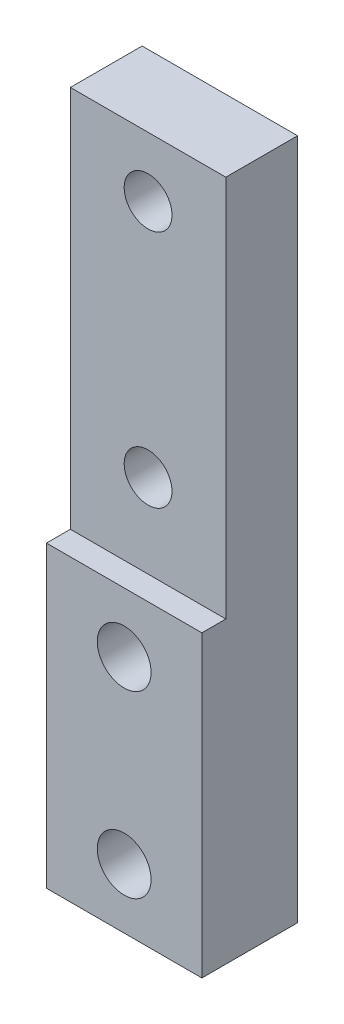
ISO-10303-21;
HEADER;
FILE_DESCRIPTION(('STEP AP214'),'2;1');
FILE_NAME('part.step','',(''),(''),'','','');
FILE_SCHEMA(('AUTOMOTIVE_DESIGN { 1 0 10303 214 1 1 1 1 }'));
ENDSEC;
DATA;
#1=APPLICATION_CONTEXT('core data for automotive mechanical design processes');
#2=APPLICATION_PROTOCOL_DEFINITION('international standard','automotive_design',2000,#1);
#3=PRODUCT_CONTEXT('',#1,'mechanical');
#4=PRODUCT('Part','Part','',(#3));
#5=PRODUCT_RELATED_PRODUCT_CATEGORY('part','',(#4));
#6=PRODUCT_DEFINITION_FORMATION('','',#4);
#7=PRODUCT_DEFINITION_CONTEXT('part definition',#1,'design');
#8=PRODUCT_DEFINITION('design','',#6,#7);
#9=PRODUCT_DEFINITION_SHAPE('','',#8);
#10=(LENGTH_UNIT() NAMED_UNIT(*) SI_UNIT(.MILLI.,.METRE.));
#11=(NAMED_UNIT(*) PLANE_ANGLE_UNIT() SI_UNIT($,.RADIAN.));
#12=(NAMED_UNIT(*) SI_UNIT($,.STERADIAN.) SOLID_ANGLE_UNIT());
#13=UNCERTAINTY_MEASURE_WITH_UNIT(LENGTH_MEASURE(1.E-05),#10,'distance_accuracy_value','');
#14=(GEOMETRIC_REPRESENTATION_CONTEXT(3) GLOBAL_UNCERTAINTY_ASSIGNED_CONTEXT((#13)) GLOBAL_UNIT_ASSIGNED_CONTEXT((#10,
#11,#12)) REPRESENTATION_CONTEXT('',''));
#15=CARTESIAN_POINT('',(0.,0.,0.));
#16=DIRECTION('',(0.,0.,1.));
#17=DIRECTION('',(1.,0.,0.));
#18=AXIS2_PLACEMENT_3D('',#15,#16,#17);
#19=CARTESIAN_POINT('',(0.,0.,8.));
#20=DIRECTION('',(0.,0.,-1.));
#21=DIRECTION('',(-1.,0.,0.));
#22=AXIS2_PLACEMENT_3D('',#19,#20,#21);
#23=PLANE('',#22);
#24=CARTESIAN_POINT('',(0.,-7.5,8.));
#25=DIRECTION('',(0.,0.,-1.));
#26=DIRECTION('',(-1.,0.,0.));
#27=AXIS2_PLACEMENT_3D('',#24,#25,#26);
#28=CIRCLE('',#27,2.25);
#29=CARTESIAN_POINT('',(-2.25,-7.5,8.));
#30=VERTEX_POINT('',#29);
#31=EDGE_CURVE('E212',#30,#30,#28,.T.);
#32=ORIENTED_EDGE('',*,*,#31,.T.);
#33=EDGE_LOOP('',(#32));
#34=FACE_BOUND('',#33,.T.);
#35=CARTESIAN_POINT('',(0.,7.5,8.));
#36=DIRECTION('',(0.,0.,-1.));
#37=DIRECTION('',(-1.,0.,0.));
#38=AXIS2_PLACEMENT_3D('',#35,#36,#37);
#39=CIRCLE('',#38,2.25);
#40=CARTESIAN_POINT('',(-2.25,7.5,8.));
#41=VERTEX_POINT('',#40);
#42=EDGE_CURVE('E222',#41,#41,#39,.T.);
#43=ORIENTED_EDGE('',*,*,#42,.T.);
#44=EDGE_LOOP('',(#43));
#45=FACE_BOUND('',#44,.T.);
#46=DIRECTION('',(0.,1.,0.));
#47=VECTOR('',#46,1.);
#48=CARTESIAN_POINT('',(6.5,-12.5,8.));
#49=LINE('',#48,#47);
#50=CARTESIAN_POINT('',(6.5,-12.5,8.));
#51=VERTEX_POINT('',#50);
#52=CARTESIAN_POINT('',(6.5,12.5,8.));
#53=VERTEX_POINT('',#52);
#54=EDGE_CURVE('E124',#51,#53,#49,.T.);
#55=ORIENTED_EDGE('',*,*,#54,.T.);
#56=DIRECTION('',(-1.,0.,0.));
#57=VECTOR('',#56,1.);
#58=CARTESIAN_POINT('',(-6.5,12.5,8.));
#59=LINE('',#58,#57);
#60=CARTESIAN_POINT('',(-6.5,12.5,8.));
#61=VERTEX_POINT('',#60);
#62=EDGE_CURVE('E79',#53,#61,#59,.T.);
#63=ORIENTED_EDGE('',*,*,#62,.T.);
#64=DIRECTION('',(0.,-1.,0.));
#65=VECTOR('',#64,1.);
#66=CARTESIAN_POINT('',(-6.5,-12.5,8.));
#67=LINE('',#66,#65);
#68=CARTESIAN_POINT('',(-6.5,-12.5,8.));
#69=VERTEX_POINT('',#68);
#70=EDGE_CURVE('E127',#61,#69,#67,.T.);
#71=ORIENTED_EDGE('',*,*,#70,.T.);
#72=DIRECTION('',(1.,0.,0.));
#73=VECTOR('',#72,1.);
#74=CARTESIAN_POINT('',(-6.5,-12.5,8.));
#75=LINE('',#74,#73);
#76=EDGE_CURVE('E57',#69,#51,#75,.T.);
#77=ORIENTED_EDGE('',*,*,#76,.T.);
#78=EDGE_LOOP('',(#55,#63,#71,#77));
#79=FACE_BOUND('',#78,.T.);
#80=ADVANCED_FACE('F33',(#34,#45,#79),#23,.F.);
#81=CARTESIAN_POINT('',(0.,0.,0.));
#82=DIRECTION('',(0.,0.,-1.));
#83=DIRECTION('',(-1.,0.,0.));
#84=AXIS2_PLACEMENT_3D('',#81,#82,#83);
#85=PLANE('',#84);
#86=CARTESIAN_POINT('',(0.,-7.5,0.));
#87=DIRECTION('',(0.,0.,-1.));
#88=DIRECTION('',(-1.,0.,0.));
#89=AXIS2_PLACEMENT_3D('',#86,#87,#88);
#90=CIRCLE('',#89,4.7);
#91=CARTESIAN_POINT('',(-4.7,-7.5,0.));
#92=VERTEX_POINT('',#91);
#93=EDGE_CURVE('E210',#92,#92,#90,.T.);
#94=ORIENTED_EDGE('',*,*,#93,.F.);
#95=EDGE_LOOP('',(#94));
#96=FACE_BOUND('',#95,.T.);
#97=CARTESIAN_POINT('',(0.,7.5,0.));
#98=DIRECTION('',(0.,0.,-1.));
#99=DIRECTION('',(-1.,0.,0.));
#100=AXIS2_PLACEMENT_3D('',#97,#98,#99);
#101=CIRCLE('',#100,4.7);
#102=CARTESIAN_POINT('',(-4.7,7.5,0.));
#103=VERTEX_POINT('',#102);
#104=EDGE_CURVE('E216',#103,#103,#101,.T.);
#105=ORIENTED_EDGE('',*,*,#104,.F.);
#106=EDGE_LOOP('',(#105));
#107=FACE_BOUND('',#106,.T.);
#108=DIRECTION('',(0.,1.,0.));
#109=VECTOR('',#108,1.);
#110=CARTESIAN_POINT('',(6.5,-12.5,0.));
#111=LINE('',#110,#109);
#112=CARTESIAN_POINT('',(6.5,-12.5,0.));
#113=VERTEX_POINT('',#112);
#114=CARTESIAN_POINT('',(6.5,44.5,0.));
#115=VERTEX_POINT('',#114);
#116=EDGE_CURVE('E122',#113,#115,#111,.T.);
#117=ORIENTED_EDGE('',*,*,#116,.F.);
#118=DIRECTION('',(1.,0.,0.));
#119=VECTOR('',#118,1.);
#120=CARTESIAN_POINT('',(-6.5,-12.5,0.));
#121=LINE('',#120,#119);
#122=CARTESIAN_POINT('',(-6.5,-12.5,0.));
#123=VERTEX_POINT('',#122);
#124=EDGE_CURVE('E72',#123,#113,#121,.T.);
#125=ORIENTED_EDGE('',*,*,#124,.F.);
#126=DIRECTION('',(0.,-1.,0.));
#127=VECTOR('',#126,1.);
#128=CARTESIAN_POINT('',(-6.5,-12.5,0.));
#129=LINE('',#128,#127);
#130=CARTESIAN_POINT('',(-6.49999999999999,44.5,0.));
#131=VERTEX_POINT('',#130);
#132=EDGE_CURVE('E132',#131,#123,#129,.T.);
#133=ORIENTED_EDGE('',*,*,#132,.F.);
#134=DIRECTION('',(1.,0.,0.));
#135=VECTOR('',#134,1.);
#136=CARTESIAN_POINT('',(-6.49999999999999,44.5,0.));
#137=LINE('',#136,#135);
#138=EDGE_CURVE('E103',#131,#115,#137,.T.);
#139=ORIENTED_EDGE('',*,*,#138,.T.);
#140=EDGE_LOOP('',(#117,#125,#133,#139));
#141=FACE_BOUND('',#140,.T.);
#142=CARTESIAN_POINT('',(0.,19.5,0.));
#143=DIRECTION('',(0.,0.,-1.));
#144=DIRECTION('',(-1.,0.,0.));
#145=AXIS2_PLACEMENT_3D('',#142,#143,#144);
#146=CIRCLE('',#145,2.);
#147=CARTESIAN_POINT('',(-2.,19.5,0.));
#148=VERTEX_POINT('',#147);
#149=EDGE_CURVE('E225',#148,#148,#146,.T.);
#150=ORIENTED_EDGE('',*,*,#149,.F.);
#151=EDGE_LOOP('',(#150));
#152=FACE_BOUND('',#151,.T.);
#153=CARTESIAN_POINT('',(0.,39.5,0.));
#154=DIRECTION('',(0.,0.,-1.));
#155=DIRECTION('',(-1.,0.,0.));
#156=AXIS2_PLACEMENT_3D('',#153,#154,#155);
#157=CIRCLE('',#156,2.);
#158=CARTESIAN_POINT('',(-2.,39.5,0.));
#159=VERTEX_POINT('',#158);
#160=EDGE_CURVE('E228',#159,#159,#157,.T.);
#161=ORIENTED_EDGE('',*,*,#160,.F.);
#162=EDGE_LOOP('',(#161));
#163=FACE_BOUND('',#162,.T.);
#164=ADVANCED_FACE('F141',(#96,#107,#141,#152,#163),#85,.T.);
#165=CARTESIAN_POINT('',(6.5,-12.5,8.));
#166=DIRECTION('',(-1.,0.,0.));
#167=DIRECTION('',(0.,0.,1.));
#168=AXIS2_PLACEMENT_3D('',#165,#166,#167);
#169=PLANE('',#168);
#170=ORIENTED_EDGE('',*,*,#116,.T.);
#171=DIRECTION('',(0.,0.,-1.));
#172=VECTOR('',#171,1.);
#173=CARTESIAN_POINT('',(6.5,44.5,6.));
#174=LINE('',#173,#172);
#175=CARTESIAN_POINT('',(6.5,44.5,6.));
#176=VERTEX_POINT('',#175);
#177=EDGE_CURVE('E105',#176,#115,#174,.T.);
#178=ORIENTED_EDGE('',*,*,#177,.F.);
#179=DIRECTION('',(0.,-1.,0.));
#180=VECTOR('',#179,1.);
#181=CARTESIAN_POINT('',(6.5,12.5,6.));
#182=LINE('',#181,#180);
#183=CARTESIAN_POINT('',(6.5,12.5,6.));
#184=VERTEX_POINT('',#183);
#185=EDGE_CURVE('E106',#176,#184,#182,.T.);
#186=ORIENTED_EDGE('',*,*,#185,.T.);
#187=DIRECTION('',(0.,0.,-1.));
#188=VECTOR('',#187,1.);
#189=CARTESIAN_POINT('',(6.5,12.5,8.));
#190=LINE('',#189,#188);
#191=EDGE_CURVE('E11',#53,#184,#190,.T.);
#192=ORIENTED_EDGE('',*,*,#191,.F.);
#193=ORIENTED_EDGE('',*,*,#54,.F.);
#194=DIRECTION('',(0.,0.,-1.));
#195=VECTOR('',#194,1.);
#196=CARTESIAN_POINT('',(6.5,-12.5,8.));
#197=LINE('',#196,#195);
#198=EDGE_CURVE('E130',#51,#113,#197,.T.);
#199=ORIENTED_EDGE('',*,*,#198,.T.);
#200=EDGE_LOOP('',(#170,#178,#186,#192,#193,#199));
#201=FACE_BOUND('',#200,.T.);
#202=ADVANCED_FACE('F35',(#201),#169,.F.);
#203=CARTESIAN_POINT('',(-6.5,12.5,8.));
#204=DIRECTION('',(0.,-1.,0.));
#205=DIRECTION('',(1.,0.,0.));
#206=AXIS2_PLACEMENT_3D('',#203,#204,#205);
#207=PLANE('',#206);
#208=ORIENTED_EDGE('',*,*,#191,.T.);
#209=DIRECTION('',(-1.,0.,0.));
#210=VECTOR('',#209,1.);
#211=CARTESIAN_POINT('',(6.5,12.5,6.));
#212=LINE('',#211,#210);
#213=CARTESIAN_POINT('',(-6.5,12.5,6.));
#214=VERTEX_POINT('',#213);
#215=EDGE_CURVE('E114',#184,#214,#212,.T.);
#216=ORIENTED_EDGE('',*,*,#215,.T.);
#217=DIRECTION('',(0.,0.,-1.));
#218=VECTOR('',#217,1.);
#219=CARTESIAN_POINT('',(-6.5,12.5,8.));
#220=LINE('',#219,#218);
#221=EDGE_CURVE('E41',#61,#214,#220,.T.);
#222=ORIENTED_EDGE('',*,*,#221,.F.);
#223=ORIENTED_EDGE('',*,*,#62,.F.);
#224=EDGE_LOOP('',(#208,#216,#222,#223));
#225=FACE_BOUND('',#224,.T.);
#226=ADVANCED_FACE('F146',(#225),#207,.F.);
#227=CARTESIAN_POINT('',(-6.5,-12.5,8.));
#228=DIRECTION('',(1.,0.,0.));
#229=DIRECTION('',(0.,1.,0.));
#230=AXIS2_PLACEMENT_3D('',#227,#228,#229);
#231=PLANE('',#230);
#232=ORIENTED_EDGE('',*,*,#132,.T.);
#233=DIRECTION('',(0.,0.,-1.));
#234=VECTOR('',#233,1.);
#235=CARTESIAN_POINT('',(-6.5,-12.5,8.));
#236=LINE('',#235,#234);
#237=EDGE_CURVE('E136',#69,#123,#236,.T.);
#238=ORIENTED_EDGE('',*,*,#237,.F.);
#239=ORIENTED_EDGE('',*,*,#70,.F.);
#240=ORIENTED_EDGE('',*,*,#221,.T.);
#241=DIRECTION('',(0.,1.,0.));
#242=VECTOR('',#241,1.);
#243=CARTESIAN_POINT('',(-6.5,12.5,6.));
#244=LINE('',#243,#242);
#245=CARTESIAN_POINT('',(-6.49999999999999,44.5,6.));
#246=VERTEX_POINT('',#245);
#247=EDGE_CURVE('E48',#214,#246,#244,.T.);
#248=ORIENTED_EDGE('',*,*,#247,.T.);
#249=DIRECTION('',(0.,0.,-1.));
#250=VECTOR('',#249,1.);
#251=CARTESIAN_POINT('',(-6.49999999999999,44.5,6.));
#252=LINE('',#251,#250);
#253=EDGE_CURVE('E97',#246,#131,#252,.T.);
#254=ORIENTED_EDGE('',*,*,#253,.T.);
#255=EDGE_LOOP('',(#232,#238,#239,#240,#248,#254));
#256=FACE_BOUND('',#255,.T.);
#257=ADVANCED_FACE('F112',(#256),#231,.F.);
#258=CARTESIAN_POINT('',(-6.5,-12.5,8.));
#259=DIRECTION('',(0.,1.,0.));
#260=DIRECTION('',(-1.,0.,0.));
#261=AXIS2_PLACEMENT_3D('',#258,#259,#260);
#262=PLANE('',#261);
#263=ORIENTED_EDGE('',*,*,#124,.T.);
#264=ORIENTED_EDGE('',*,*,#198,.F.);
#265=ORIENTED_EDGE('',*,*,#76,.F.);
#266=ORIENTED_EDGE('',*,*,#237,.T.);
#267=EDGE_LOOP('',(#263,#264,#265,#266));
#268=FACE_BOUND('',#267,.T.);
#269=ADVANCED_FACE('F138',(#268),#262,.F.);
#270=CARTESIAN_POINT('',(-6.49999999999999,44.5,6.));
#271=DIRECTION('',(0.,1.,0.));
#272=DIRECTION('',(0.,0.,1.));
#273=AXIS2_PLACEMENT_3D('',#270,#271,#272);
#274=PLANE('',#273);
#275=ORIENTED_EDGE('',*,*,#138,.F.);
#276=ORIENTED_EDGE('',*,*,#253,.F.);
#277=DIRECTION('',(1.,0.,0.));
#278=VECTOR('',#277,1.);
#279=CARTESIAN_POINT('',(-6.49999999999999,44.5,6.));
#280=LINE('',#279,#278);
#281=EDGE_CURVE('E100',#246,#176,#280,.T.);
#282=ORIENTED_EDGE('',*,*,#281,.T.);
#283=ORIENTED_EDGE('',*,*,#177,.T.);
#284=EDGE_LOOP('',(#275,#276,#282,#283));
#285=FACE_BOUND('',#284,.T.);
#286=ADVANCED_FACE('F98',(#285),#274,.T.);
#287=CARTESIAN_POINT('',(0.,0.,6.));
#288=DIRECTION('',(0.,0.,-1.));
#289=DIRECTION('',(-1.,0.,0.));
#290=AXIS2_PLACEMENT_3D('',#287,#288,#289);
#291=PLANE('',#290);
#292=CARTESIAN_POINT('',(0.,19.5,6.));
#293=DIRECTION('',(0.,0.,-1.));
#294=DIRECTION('',(-1.,0.,0.));
#295=AXIS2_PLACEMENT_3D('',#292,#293,#294);
#296=CIRCLE('',#295,2.);
#297=CARTESIAN_POINT('',(-2.,19.5,6.));
#298=VERTEX_POINT('',#297);
#299=EDGE_CURVE('E226',#298,#298,#296,.T.);
#300=ORIENTED_EDGE('',*,*,#299,.T.);
#301=EDGE_LOOP('',(#300));
#302=FACE_BOUND('',#301,.T.);
#303=CARTESIAN_POINT('',(0.,39.5,6.));
#304=DIRECTION('',(0.,0.,-1.));
#305=DIRECTION('',(-1.,0.,0.));
#306=AXIS2_PLACEMENT_3D('',#303,#304,#305);
#307=CIRCLE('',#306,2.);
#308=CARTESIAN_POINT('',(-2.,39.5,6.));
#309=VERTEX_POINT('',#308);
#310=EDGE_CURVE('E121',#309,#309,#307,.T.);
#311=ORIENTED_EDGE('',*,*,#310,.T.);
#312=EDGE_LOOP('',(#311));
#313=FACE_BOUND('',#312,.T.);
#314=ORIENTED_EDGE('',*,*,#215,.F.);
#315=ORIENTED_EDGE('',*,*,#185,.F.);
#316=ORIENTED_EDGE('',*,*,#281,.F.);
#317=ORIENTED_EDGE('',*,*,#247,.F.);
#318=EDGE_LOOP('',(#314,#315,#316,#317));
#319=FACE_BOUND('',#318,.T.);
#320=ADVANCED_FACE('F108',(#302,#313,#319),#291,.F.);
#321=CARTESIAN_POINT('',(0.,39.5,6.));
#322=DIRECTION('',(0.,0.,-1.));
#323=DIRECTION('',(-1.,0.,0.));
#324=AXIS2_PLACEMENT_3D('',#321,#322,#323);
#325=CYLINDRICAL_SURFACE('',#324,2.);
#326=ORIENTED_EDGE('',*,*,#310,.F.);
#327=EDGE_LOOP('',(#326));
#328=FACE_BOUND('',#327,.T.);
#329=ORIENTED_EDGE('',*,*,#160,.T.);
#330=EDGE_LOOP('',(#329));
#331=FACE_BOUND('',#330,.T.);
#332=ADVANCED_FACE('F173',(#328,#331),#325,.F.);
#333=CARTESIAN_POINT('',(0.,19.5,6.));
#334=DIRECTION('',(0.,0.,-1.));
#335=DIRECTION('',(-1.,0.,0.));
#336=AXIS2_PLACEMENT_3D('',#333,#334,#335);
#337=CYLINDRICAL_SURFACE('',#336,2.);
#338=ORIENTED_EDGE('',*,*,#299,.F.);
#339=EDGE_LOOP('',(#338));
#340=FACE_BOUND('',#339,.T.);
#341=ORIENTED_EDGE('',*,*,#149,.T.);
#342=EDGE_LOOP('',(#341));
#343=FACE_BOUND('',#342,.T.);
#344=ADVANCED_FACE('F178',(#340,#343),#337,.F.);
#345=CARTESIAN_POINT('',(0.,7.5,0.));
#346=DIRECTION('',(0.,0.,-1.));
#347=DIRECTION('',(-1.,0.,0.));
#348=AXIS2_PLACEMENT_3D('',#345,#346,#347);
#349=CYLINDRICAL_SURFACE('',#348,2.25);
#350=ORIENTED_EDGE('',*,*,#42,.F.);
#351=EDGE_LOOP('',(#350));
#352=FACE_BOUND('',#351,.T.);
#353=CARTESIAN_POINT('',(0.,7.5,2.45));
#354=DIRECTION('',(0.,0.,-1.));
#355=DIRECTION('',(-1.,0.,0.));
#356=AXIS2_PLACEMENT_3D('',#353,#354,#355);
#357=CIRCLE('',#356,2.25);
#358=CARTESIAN_POINT('',(-2.25,7.5,2.45));
#359=VERTEX_POINT('',#358);
#360=EDGE_CURVE('E219',#359,#359,#357,.T.);
#361=ORIENTED_EDGE('',*,*,#360,.T.);
#362=EDGE_LOOP('',(#361));
#363=FACE_BOUND('',#362,.T.);
#364=ADVANCED_FACE('F186',(#352,#363),#349,.F.);
#365=CARTESIAN_POINT('',(0.,7.5,0.));
#366=DIRECTION('',(0.,0.,-1.));
#367=DIRECTION('',(-1.,0.,0.));
#368=AXIS2_PLACEMENT_3D('',#365,#366,#367);
#369=CONICAL_SURFACE('',#368,4.7,0.785398163397449);
#370=ORIENTED_EDGE('',*,*,#360,.F.);
#371=EDGE_LOOP('',(#370));
#372=FACE_BOUND('',#371,.T.);
#373=ORIENTED_EDGE('',*,*,#104,.T.);
#374=EDGE_LOOP('',(#373));
#375=FACE_BOUND('',#374,.T.);
#376=ADVANCED_FACE('F190',(#372,#375),#369,.F.);
#377=CARTESIAN_POINT('',(0.,-7.5,0.));
#378=DIRECTION('',(0.,0.,-1.));
#379=DIRECTION('',(-1.,0.,0.));
#380=AXIS2_PLACEMENT_3D('',#377,#378,#379);
#381=CYLINDRICAL_SURFACE('',#380,2.25);
#382=ORIENTED_EDGE('',*,*,#31,.F.);
#383=EDGE_LOOP('',(#382));
#384=FACE_BOUND('',#383,.T.);
#385=CARTESIAN_POINT('',(0.,-7.5,2.45));
#386=DIRECTION('',(0.,0.,-1.));
#387=DIRECTION('',(-1.,0.,0.));
#388=AXIS2_PLACEMENT_3D('',#385,#386,#387);
#389=CIRCLE('',#388,2.25);
#390=CARTESIAN_POINT('',(-2.25,-7.5,2.45));
#391=VERTEX_POINT('',#390);
#392=EDGE_CURVE('E207',#391,#391,#389,.T.);
#393=ORIENTED_EDGE('',*,*,#392,.T.);
#394=EDGE_LOOP('',(#393));
#395=FACE_BOUND('',#394,.T.);
#396=ADVANCED_FACE('F194',(#384,#395),#381,.F.);
#397=CARTESIAN_POINT('',(0.,-7.5,0.));
#398=DIRECTION('',(0.,0.,-1.));
#399=DIRECTION('',(-1.,0.,0.));
#400=AXIS2_PLACEMENT_3D('',#397,#398,#399);
#401=CONICAL_SURFACE('',#400,4.7,0.785398163397449);
#402=ORIENTED_EDGE('',*,*,#392,.F.);
#403=EDGE_LOOP('',(#402));
#404=FACE_BOUND('',#403,.T.);
#405=ORIENTED_EDGE('',*,*,#93,.T.);
#406=EDGE_LOOP('',(#405));
#407=FACE_BOUND('',#406,.T.);
#408=ADVANCED_FACE('F198',(#404,#407),#401,.F.);
#409=CLOSED_SHELL('',(#80,#164,#202,#226,#257,#269,#286,#320,#332,#344,#364,#376,#396,#408));
#410=MANIFOLD_SOLID_BREP('B2',#409);
#411=ADVANCED_BREP_SHAPE_REPRESENTATION('',(#18,#410),#14);
#412=SHAPE_DEFINITION_REPRESENTATION(#9,#411);
ENDSEC;
END-ISO-10303-21;
